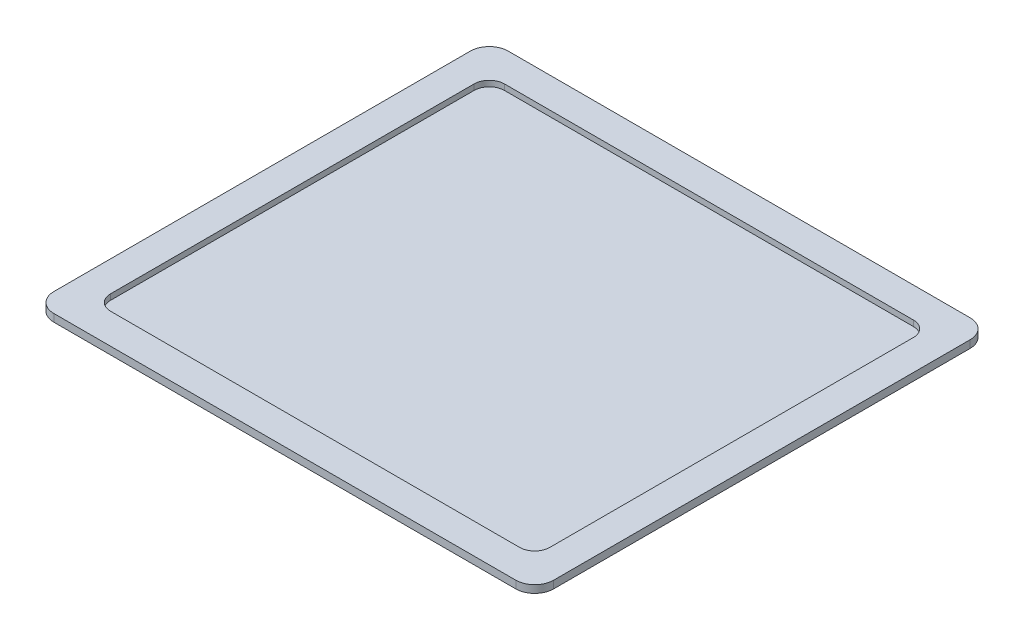
ISO-10303-21;
HEADER;
FILE_DESCRIPTION(('STEP AP214'),'2;1');
FILE_NAME('part.step','',(''),(''),'','','');
FILE_SCHEMA(('AUTOMOTIVE_DESIGN { 1 0 10303 214 1 1 1 1 }'));
ENDSEC;
DATA;
#1=APPLICATION_CONTEXT('core data for automotive mechanical design processes');
#2=APPLICATION_PROTOCOL_DEFINITION('international standard','automotive_design',2000,#1);
#3=PRODUCT_CONTEXT('',#1,'mechanical');
#4=PRODUCT('Part','Part','',(#3));
#5=PRODUCT_RELATED_PRODUCT_CATEGORY('part','',(#4));
#6=PRODUCT_DEFINITION_FORMATION('','',#4);
#7=PRODUCT_DEFINITION_CONTEXT('part definition',#1,'design');
#8=PRODUCT_DEFINITION('design','',#6,#7);
#9=PRODUCT_DEFINITION_SHAPE('','',#8);
#10=(LENGTH_UNIT() NAMED_UNIT(*) SI_UNIT(.MILLI.,.METRE.));
#11=(NAMED_UNIT(*) PLANE_ANGLE_UNIT() SI_UNIT($,.RADIAN.));
#12=(NAMED_UNIT(*) SI_UNIT($,.STERADIAN.) SOLID_ANGLE_UNIT());
#13=UNCERTAINTY_MEASURE_WITH_UNIT(LENGTH_MEASURE(1.E-05),#10,'distance_accuracy_value','');
#14=(GEOMETRIC_REPRESENTATION_CONTEXT(3) GLOBAL_UNCERTAINTY_ASSIGNED_CONTEXT((#13)) GLOBAL_UNIT_ASSIGNED_CONTEXT((#10,
#11,#12)) REPRESENTATION_CONTEXT('',''));
#15=CARTESIAN_POINT('',(0.,0.,0.));
#16=DIRECTION('',(0.,0.,1.));
#17=DIRECTION('',(1.,0.,0.));
#18=AXIS2_PLACEMENT_3D('',#15,#16,#17);
#19=CARTESIAN_POINT('',(305.,0.,275.));
#20=DIRECTION('',(0.,1.,0.));
#21=DIRECTION('',(0.,0.,1.));
#22=AXIS2_PLACEMENT_3D('',#19,#20,#21);
#23=PLANE('',#22);
#24=CARTESIAN_POINT('',(305.,0.,275.));
#25=DIRECTION('',(0.,1.,0.));
#26=DIRECTION('',(0.,0.,1.));
#27=AXIS2_PLACEMENT_3D('',#24,#25,#26);
#28=CIRCLE('',#27,25.);
#29=CARTESIAN_POINT('',(305.,0.,300.));
#30=VERTEX_POINT('',#29);
#31=CARTESIAN_POINT('',(330.,0.,275.));
#32=VERTEX_POINT('',#31);
#33=EDGE_CURVE('E303',#30,#32,#28,.T.);
#34=ORIENTED_EDGE('',*,*,#33,.F.);
#35=DIRECTION('',(1.,0.,0.));
#36=VECTOR('',#35,1.);
#37=CARTESIAN_POINT('',(-305.,0.,300.));
#38=LINE('',#37,#36);
#39=CARTESIAN_POINT('',(-305.,0.,300.));
#40=VERTEX_POINT('',#39);
#41=EDGE_CURVE('E308',#40,#30,#38,.T.);
#42=ORIENTED_EDGE('',*,*,#41,.F.);
#43=CARTESIAN_POINT('',(-305.,0.,275.));
#44=DIRECTION('',(0.,1.,0.));
#45=DIRECTION('',(0.,0.,-1.));
#46=AXIS2_PLACEMENT_3D('',#43,#44,#45);
#47=CIRCLE('',#46,25.);
#48=CARTESIAN_POINT('',(-330.,0.,275.));
#49=VERTEX_POINT('',#48);
#50=EDGE_CURVE('E335',#49,#40,#47,.T.);
#51=ORIENTED_EDGE('',*,*,#50,.F.);
#52=DIRECTION('',(0.,0.,1.));
#53=VECTOR('',#52,1.);
#54=CARTESIAN_POINT('',(-330.,0.,275.));
#55=LINE('',#54,#53);
#56=CARTESIAN_POINT('',(-330.,0.,-275.));
#57=VERTEX_POINT('',#56);
#58=EDGE_CURVE('E333',#57,#49,#55,.T.);
#59=ORIENTED_EDGE('',*,*,#58,.F.);
#60=CARTESIAN_POINT('',(-305.,0.,-275.));
#61=DIRECTION('',(0.,1.,0.));
#62=DIRECTION('',(0.,0.,-1.));
#63=AXIS2_PLACEMENT_3D('',#60,#61,#62);
#64=CIRCLE('',#63,25.);
#65=CARTESIAN_POINT('',(-305.,0.,-300.));
#66=VERTEX_POINT('',#65);
#67=EDGE_CURVE('E331',#66,#57,#64,.T.);
#68=ORIENTED_EDGE('',*,*,#67,.F.);
#69=DIRECTION('',(-1.,0.,0.));
#70=VECTOR('',#69,1.);
#71=CARTESIAN_POINT('',(-305.,0.,-300.));
#72=LINE('',#71,#70);
#73=CARTESIAN_POINT('',(305.,0.,-300.));
#74=VERTEX_POINT('',#73);
#75=EDGE_CURVE('E329',#74,#66,#72,.T.);
#76=ORIENTED_EDGE('',*,*,#75,.F.);
#77=CARTESIAN_POINT('',(305.,0.,-275.));
#78=DIRECTION('',(0.,1.,0.));
#79=DIRECTION('',(0.,0.,-1.));
#80=AXIS2_PLACEMENT_3D('',#77,#78,#79);
#81=CIRCLE('',#80,25.);
#82=CARTESIAN_POINT('',(330.,0.,-275.));
#83=VERTEX_POINT('',#82);
#84=EDGE_CURVE('E327',#83,#74,#81,.T.);
#85=ORIENTED_EDGE('',*,*,#84,.F.);
#86=DIRECTION('',(0.,0.,-1.));
#87=VECTOR('',#86,1.);
#88=CARTESIAN_POINT('',(330.,0.,275.));
#89=LINE('',#88,#87);
#90=EDGE_CURVE('E325',#32,#83,#89,.T.);
#91=ORIENTED_EDGE('',*,*,#90,.F.);
#92=EDGE_LOOP('',(#34,#42,#51,#59,#68,#76,#85,#91));
#93=FACE_BOUND('',#92,.T.);
#94=CARTESIAN_POINT('',(270.,0.,240.));
#95=DIRECTION('',(0.,1.,0.));
#96=DIRECTION('',(0.,0.,1.));
#97=AXIS2_PLACEMENT_3D('',#94,#95,#96);
#98=CIRCLE('',#97,30.);
#99=CARTESIAN_POINT('',(300.,0.,240.));
#100=VERTEX_POINT('',#99);
#101=CARTESIAN_POINT('',(270.,0.,270.));
#102=VERTEX_POINT('',#101);
#103=EDGE_CURVE('E11',#100,#102,#98,.F.);
#104=ORIENTED_EDGE('',*,*,#103,.F.);
#105=DIRECTION('',(0.,0.,1.));
#106=VECTOR('',#105,1.);
#107=CARTESIAN_POINT('',(300.,0.,275.));
#108=LINE('',#107,#106);
#109=CARTESIAN_POINT('',(300.,0.,-240.));
#110=VERTEX_POINT('',#109);
#111=EDGE_CURVE('E42',#110,#100,#108,.T.);
#112=ORIENTED_EDGE('',*,*,#111,.F.);
#113=CARTESIAN_POINT('',(270.,0.,-240.));
#114=DIRECTION('',(0.,1.,0.));
#115=DIRECTION('',(0.,0.,1.));
#116=AXIS2_PLACEMENT_3D('',#113,#114,#115);
#117=CIRCLE('',#116,30.);
#118=CARTESIAN_POINT('',(270.,0.,-270.));
#119=VERTEX_POINT('',#118);
#120=EDGE_CURVE('E379',#119,#110,#117,.F.);
#121=ORIENTED_EDGE('',*,*,#120,.F.);
#122=DIRECTION('',(1.,0.,0.));
#123=VECTOR('',#122,1.);
#124=CARTESIAN_POINT('',(305.,0.,-270.));
#125=LINE('',#124,#123);
#126=CARTESIAN_POINT('',(-270.,0.,-270.));
#127=VERTEX_POINT('',#126);
#128=EDGE_CURVE('E376',#127,#119,#125,.T.);
#129=ORIENTED_EDGE('',*,*,#128,.F.);
#130=CARTESIAN_POINT('',(-270.,0.,-240.));
#131=DIRECTION('',(0.,1.,0.));
#132=DIRECTION('',(0.,0.,1.));
#133=AXIS2_PLACEMENT_3D('',#130,#131,#132);
#134=CIRCLE('',#133,30.);
#135=CARTESIAN_POINT('',(-300.,0.,-240.));
#136=VERTEX_POINT('',#135);
#137=EDGE_CURVE('E373',#136,#127,#134,.F.);
#138=ORIENTED_EDGE('',*,*,#137,.F.);
#139=DIRECTION('',(0.,0.,-1.));
#140=VECTOR('',#139,1.);
#141=CARTESIAN_POINT('',(-300.,0.,275.));
#142=LINE('',#141,#140);
#143=CARTESIAN_POINT('',(-300.,0.,240.));
#144=VERTEX_POINT('',#143);
#145=EDGE_CURVE('E370',#144,#136,#142,.T.);
#146=ORIENTED_EDGE('',*,*,#145,.F.);
#147=CARTESIAN_POINT('',(-270.,0.,240.));
#148=DIRECTION('',(0.,1.,0.));
#149=DIRECTION('',(0.,0.,1.));
#150=AXIS2_PLACEMENT_3D('',#147,#148,#149);
#151=CIRCLE('',#150,30.);
#152=CARTESIAN_POINT('',(-270.,0.,270.));
#153=VERTEX_POINT('',#152);
#154=EDGE_CURVE('E367',#153,#144,#151,.F.);
#155=ORIENTED_EDGE('',*,*,#154,.F.);
#156=DIRECTION('',(-1.,0.,0.));
#157=VECTOR('',#156,1.);
#158=CARTESIAN_POINT('',(305.,0.,270.));
#159=LINE('',#158,#157);
#160=EDGE_CURVE('E364',#102,#153,#159,.T.);
#161=ORIENTED_EDGE('',*,*,#160,.F.);
#162=EDGE_LOOP('',(#104,#112,#121,#129,#138,#146,#155,#161));
#163=FACE_BOUND('',#162,.T.);
#164=ADVANCED_FACE('F34',(#93,#163),#23,.F.);
#165=CARTESIAN_POINT('',(305.,10.,275.));
#166=DIRECTION('',(0.,1.,0.));
#167=DIRECTION('',(0.,0.,1.));
#168=AXIS2_PLACEMENT_3D('',#165,#166,#167);
#169=PLANE('',#168);
#170=CARTESIAN_POINT('',(305.,10.,275.));
#171=DIRECTION('',(0.,1.,0.));
#172=DIRECTION('',(0.,0.,1.));
#173=AXIS2_PLACEMENT_3D('',#170,#171,#172);
#174=CIRCLE('',#173,25.);
#175=CARTESIAN_POINT('',(305.,10.,300.));
#176=VERTEX_POINT('',#175);
#177=CARTESIAN_POINT('',(330.,10.,275.));
#178=VERTEX_POINT('',#177);
#179=EDGE_CURVE('E304',#176,#178,#174,.T.);
#180=ORIENTED_EDGE('',*,*,#179,.T.);
#181=DIRECTION('',(0.,0.,-1.));
#182=VECTOR('',#181,1.);
#183=CARTESIAN_POINT('',(330.,10.,275.));
#184=LINE('',#183,#182);
#185=CARTESIAN_POINT('',(330.,10.,-275.));
#186=VERTEX_POINT('',#185);
#187=EDGE_CURVE('E307',#178,#186,#184,.T.);
#188=ORIENTED_EDGE('',*,*,#187,.T.);
#189=CARTESIAN_POINT('',(305.,10.,-275.));
#190=DIRECTION('',(0.,1.,0.));
#191=DIRECTION('',(0.,0.,-1.));
#192=AXIS2_PLACEMENT_3D('',#189,#190,#191);
#193=CIRCLE('',#192,25.);
#194=CARTESIAN_POINT('',(305.,10.,-300.));
#195=VERTEX_POINT('',#194);
#196=EDGE_CURVE('E310',#186,#195,#193,.T.);
#197=ORIENTED_EDGE('',*,*,#196,.T.);
#198=DIRECTION('',(-1.,0.,0.));
#199=VECTOR('',#198,1.);
#200=CARTESIAN_POINT('',(-305.,10.,-300.));
#201=LINE('',#200,#199);
#202=CARTESIAN_POINT('',(-305.,10.,-300.));
#203=VERTEX_POINT('',#202);
#204=EDGE_CURVE('E312',#195,#203,#201,.T.);
#205=ORIENTED_EDGE('',*,*,#204,.T.);
#206=CARTESIAN_POINT('',(-305.,10.,-275.));
#207=DIRECTION('',(0.,1.,0.));
#208=DIRECTION('',(0.,0.,-1.));
#209=AXIS2_PLACEMENT_3D('',#206,#207,#208);
#210=CIRCLE('',#209,25.);
#211=CARTESIAN_POINT('',(-330.,10.,-275.));
#212=VERTEX_POINT('',#211);
#213=EDGE_CURVE('E314',#203,#212,#210,.T.);
#214=ORIENTED_EDGE('',*,*,#213,.T.);
#215=DIRECTION('',(0.,0.,1.));
#216=VECTOR('',#215,1.);
#217=CARTESIAN_POINT('',(-330.,10.,275.));
#218=LINE('',#217,#216);
#219=CARTESIAN_POINT('',(-330.,10.,275.));
#220=VERTEX_POINT('',#219);
#221=EDGE_CURVE('E316',#212,#220,#218,.T.);
#222=ORIENTED_EDGE('',*,*,#221,.T.);
#223=CARTESIAN_POINT('',(-305.,10.,275.));
#224=DIRECTION('',(0.,1.,0.));
#225=DIRECTION('',(0.,0.,-1.));
#226=AXIS2_PLACEMENT_3D('',#223,#224,#225);
#227=CIRCLE('',#226,25.);
#228=CARTESIAN_POINT('',(-305.,10.,300.));
#229=VERTEX_POINT('',#228);
#230=EDGE_CURVE('E318',#220,#229,#227,.T.);
#231=ORIENTED_EDGE('',*,*,#230,.T.);
#232=DIRECTION('',(1.,0.,0.));
#233=VECTOR('',#232,1.);
#234=CARTESIAN_POINT('',(-305.,10.,300.));
#235=LINE('',#234,#233);
#236=EDGE_CURVE('E320',#229,#176,#235,.T.);
#237=ORIENTED_EDGE('',*,*,#236,.T.);
#238=EDGE_LOOP('',(#180,#188,#197,#205,#214,#222,#231,#237));
#239=FACE_BOUND('',#238,.T.);
#240=DIRECTION('',(1.,0.,0.));
#241=VECTOR('',#240,1.);
#242=CARTESIAN_POINT('',(270.,10.,260.));
#243=LINE('',#242,#241);
#244=CARTESIAN_POINT('',(-270.,10.,260.));
#245=VERTEX_POINT('',#244);
#246=CARTESIAN_POINT('',(270.,10.,260.));
#247=VERTEX_POINT('',#246);
#248=EDGE_CURVE('E265',#245,#247,#243,.T.);
#249=ORIENTED_EDGE('',*,*,#248,.F.);
#250=CARTESIAN_POINT('',(-270.,10.,240.));
#251=DIRECTION('',(0.,1.,0.));
#252=DIRECTION('',(0.,0.,-1.));
#253=AXIS2_PLACEMENT_3D('',#250,#251,#252);
#254=CIRCLE('',#253,20.);
#255=CARTESIAN_POINT('',(-290.,10.,240.));
#256=VERTEX_POINT('',#255);
#257=EDGE_CURVE('E263',#256,#245,#254,.T.);
#258=ORIENTED_EDGE('',*,*,#257,.F.);
#259=DIRECTION('',(0.,0.,1.));
#260=VECTOR('',#259,1.);
#261=CARTESIAN_POINT('',(-290.,10.,240.));
#262=LINE('',#261,#260);
#263=CARTESIAN_POINT('',(-290.,10.,-240.));
#264=VERTEX_POINT('',#263);
#265=EDGE_CURVE('E278',#264,#256,#262,.T.);
#266=ORIENTED_EDGE('',*,*,#265,.F.);
#267=CARTESIAN_POINT('',(-270.,10.,-240.));
#268=DIRECTION('',(0.,1.,0.));
#269=DIRECTION('',(0.,0.,1.));
#270=AXIS2_PLACEMENT_3D('',#267,#268,#269);
#271=CIRCLE('',#270,20.);
#272=CARTESIAN_POINT('',(-270.,10.,-260.));
#273=VERTEX_POINT('',#272);
#274=EDGE_CURVE('E275',#273,#264,#271,.T.);
#275=ORIENTED_EDGE('',*,*,#274,.F.);
#276=DIRECTION('',(-1.,0.,0.));
#277=VECTOR('',#276,1.);
#278=CARTESIAN_POINT('',(270.,10.,-260.));
#279=LINE('',#278,#277);
#280=CARTESIAN_POINT('',(270.,10.,-260.));
#281=VERTEX_POINT('',#280);
#282=EDGE_CURVE('E273',#281,#273,#279,.T.);
#283=ORIENTED_EDGE('',*,*,#282,.F.);
#284=CARTESIAN_POINT('',(270.,10.,-240.));
#285=DIRECTION('',(0.,1.,0.));
#286=DIRECTION('',(0.,0.,1.));
#287=AXIS2_PLACEMENT_3D('',#284,#285,#286);
#288=CIRCLE('',#287,20.);
#289=CARTESIAN_POINT('',(290.,10.,-240.));
#290=VERTEX_POINT('',#289);
#291=EDGE_CURVE('E271',#290,#281,#288,.T.);
#292=ORIENTED_EDGE('',*,*,#291,.F.);
#293=DIRECTION('',(0.,0.,-1.));
#294=VECTOR('',#293,1.);
#295=CARTESIAN_POINT('',(290.,10.,240.));
#296=LINE('',#295,#294);
#297=CARTESIAN_POINT('',(290.,10.,240.));
#298=VERTEX_POINT('',#297);
#299=EDGE_CURVE('E269',#298,#290,#296,.T.);
#300=ORIENTED_EDGE('',*,*,#299,.F.);
#301=CARTESIAN_POINT('',(270.,10.,240.));
#302=DIRECTION('',(0.,1.,0.));
#303=DIRECTION('',(0.,0.,1.));
#304=AXIS2_PLACEMENT_3D('',#301,#302,#303);
#305=CIRCLE('',#304,20.);
#306=EDGE_CURVE('E267',#247,#298,#305,.T.);
#307=ORIENTED_EDGE('',*,*,#306,.F.);
#308=EDGE_LOOP('',(#249,#258,#266,#275,#283,#292,#300,#307));
#309=FACE_BOUND('',#308,.T.);
#310=ADVANCED_FACE('F409',(#239,#309),#169,.T.);
#311=CARTESIAN_POINT('',(305.,10.,275.));
#312=DIRECTION('',(0.,-1.,0.));
#313=DIRECTION('',(0.,0.,-1.));
#314=AXIS2_PLACEMENT_3D('',#311,#312,#313);
#315=CYLINDRICAL_SURFACE('',#314,25.);
#316=ORIENTED_EDGE('',*,*,#33,.T.);
#317=DIRECTION('',(0.,-1.,0.));
#318=VECTOR('',#317,1.);
#319=CARTESIAN_POINT('',(330.,10.,275.));
#320=LINE('',#319,#318);
#321=EDGE_CURVE('E358',#178,#32,#320,.T.);
#322=ORIENTED_EDGE('',*,*,#321,.F.);
#323=ORIENTED_EDGE('',*,*,#179,.F.);
#324=DIRECTION('',(0.,-1.,0.));
#325=VECTOR('',#324,1.);
#326=CARTESIAN_POINT('',(305.,10.,300.));
#327=LINE('',#326,#325);
#328=EDGE_CURVE('E322',#176,#30,#327,.T.);
#329=ORIENTED_EDGE('',*,*,#328,.T.);
#330=EDGE_LOOP('',(#316,#322,#323,#329));
#331=FACE_BOUND('',#330,.T.);
#332=ADVANCED_FACE('F36',(#331),#315,.T.);
#333=CARTESIAN_POINT('',(330.,10.,275.));
#334=DIRECTION('',(-1.,0.,0.));
#335=DIRECTION('',(0.,0.,1.));
#336=AXIS2_PLACEMENT_3D('',#333,#334,#335);
#337=PLANE('',#336);
#338=ORIENTED_EDGE('',*,*,#90,.T.);
#339=DIRECTION('',(0.,-1.,0.));
#340=VECTOR('',#339,1.);
#341=CARTESIAN_POINT('',(330.,10.,-275.));
#342=LINE('',#341,#340);
#343=EDGE_CURVE('E355',#186,#83,#342,.T.);
#344=ORIENTED_EDGE('',*,*,#343,.F.);
#345=ORIENTED_EDGE('',*,*,#187,.F.);
#346=ORIENTED_EDGE('',*,*,#321,.T.);
#347=EDGE_LOOP('',(#338,#344,#345,#346));
#348=FACE_BOUND('',#347,.T.);
#349=ADVANCED_FACE('F443',(#348),#337,.F.);
#350=CARTESIAN_POINT('',(305.,10.,-275.));
#351=DIRECTION('',(0.,-1.,0.));
#352=DIRECTION('',(0.,0.,-1.));
#353=AXIS2_PLACEMENT_3D('',#350,#351,#352);
#354=CYLINDRICAL_SURFACE('',#353,25.);
#355=ORIENTED_EDGE('',*,*,#84,.T.);
#356=DIRECTION('',(0.,-1.,0.));
#357=VECTOR('',#356,1.);
#358=CARTESIAN_POINT('',(305.,10.,-300.));
#359=LINE('',#358,#357);
#360=EDGE_CURVE('E352',#195,#74,#359,.T.);
#361=ORIENTED_EDGE('',*,*,#360,.F.);
#362=ORIENTED_EDGE('',*,*,#196,.F.);
#363=ORIENTED_EDGE('',*,*,#343,.T.);
#364=EDGE_LOOP('',(#355,#361,#362,#363));
#365=FACE_BOUND('',#364,.T.);
#366=ADVANCED_FACE('F440',(#365),#354,.T.);
#367=CARTESIAN_POINT('',(-305.,10.,-300.));
#368=DIRECTION('',(0.,0.,1.));
#369=DIRECTION('',(1.,0.,0.));
#370=AXIS2_PLACEMENT_3D('',#367,#368,#369);
#371=PLANE('',#370);
#372=ORIENTED_EDGE('',*,*,#75,.T.);
#373=DIRECTION('',(0.,-1.,0.));
#374=VECTOR('',#373,1.);
#375=CARTESIAN_POINT('',(-305.,10.,-300.));
#376=LINE('',#375,#374);
#377=EDGE_CURVE('E349',#203,#66,#376,.T.);
#378=ORIENTED_EDGE('',*,*,#377,.F.);
#379=ORIENTED_EDGE('',*,*,#204,.F.);
#380=ORIENTED_EDGE('',*,*,#360,.T.);
#381=EDGE_LOOP('',(#372,#378,#379,#380));
#382=FACE_BOUND('',#381,.T.);
#383=ADVANCED_FACE('F436',(#382),#371,.F.);
#384=CARTESIAN_POINT('',(-305.,10.,-275.));
#385=DIRECTION('',(0.,-1.,0.));
#386=DIRECTION('',(0.,0.,-1.));
#387=AXIS2_PLACEMENT_3D('',#384,#385,#386);
#388=CYLINDRICAL_SURFACE('',#387,25.);
#389=ORIENTED_EDGE('',*,*,#67,.T.);
#390=DIRECTION('',(0.,-1.,0.));
#391=VECTOR('',#390,1.);
#392=CARTESIAN_POINT('',(-330.,10.,-275.));
#393=LINE('',#392,#391);
#394=EDGE_CURVE('E346',#212,#57,#393,.T.);
#395=ORIENTED_EDGE('',*,*,#394,.F.);
#396=ORIENTED_EDGE('',*,*,#213,.F.);
#397=ORIENTED_EDGE('',*,*,#377,.T.);
#398=EDGE_LOOP('',(#389,#395,#396,#397));
#399=FACE_BOUND('',#398,.T.);
#400=ADVANCED_FACE('F432',(#399),#388,.T.);
#401=CARTESIAN_POINT('',(-330.,10.,275.));
#402=DIRECTION('',(1.,0.,0.));
#403=DIRECTION('',(0.,0.,-1.));
#404=AXIS2_PLACEMENT_3D('',#401,#402,#403);
#405=PLANE('',#404);
#406=ORIENTED_EDGE('',*,*,#58,.T.);
#407=DIRECTION('',(0.,-1.,0.));
#408=VECTOR('',#407,1.);
#409=CARTESIAN_POINT('',(-330.,10.,275.));
#410=LINE('',#409,#408);
#411=EDGE_CURVE('E343',#220,#49,#410,.T.);
#412=ORIENTED_EDGE('',*,*,#411,.F.);
#413=ORIENTED_EDGE('',*,*,#221,.F.);
#414=ORIENTED_EDGE('',*,*,#394,.T.);
#415=EDGE_LOOP('',(#406,#412,#413,#414));
#416=FACE_BOUND('',#415,.T.);
#417=ADVANCED_FACE('F428',(#416),#405,.F.);
#418=CARTESIAN_POINT('',(-305.,10.,275.));
#419=DIRECTION('',(0.,-1.,0.));
#420=DIRECTION('',(0.,0.,-1.));
#421=AXIS2_PLACEMENT_3D('',#418,#419,#420);
#422=CYLINDRICAL_SURFACE('',#421,25.);
#423=ORIENTED_EDGE('',*,*,#50,.T.);
#424=DIRECTION('',(0.,-1.,0.));
#425=VECTOR('',#424,1.);
#426=CARTESIAN_POINT('',(-305.,10.,300.));
#427=LINE('',#426,#425);
#428=EDGE_CURVE('E340',#229,#40,#427,.T.);
#429=ORIENTED_EDGE('',*,*,#428,.F.);
#430=ORIENTED_EDGE('',*,*,#230,.F.);
#431=ORIENTED_EDGE('',*,*,#411,.T.);
#432=EDGE_LOOP('',(#423,#429,#430,#431));
#433=FACE_BOUND('',#432,.T.);
#434=ADVANCED_FACE('F424',(#433),#422,.T.);
#435=CARTESIAN_POINT('',(-305.,10.,300.));
#436=DIRECTION('',(0.,0.,-1.));
#437=DIRECTION('',(-1.,0.,0.));
#438=AXIS2_PLACEMENT_3D('',#435,#436,#437);
#439=PLANE('',#438);
#440=ORIENTED_EDGE('',*,*,#41,.T.);
#441=ORIENTED_EDGE('',*,*,#328,.F.);
#442=ORIENTED_EDGE('',*,*,#236,.F.);
#443=ORIENTED_EDGE('',*,*,#428,.T.);
#444=EDGE_LOOP('',(#440,#441,#442,#443));
#445=FACE_BOUND('',#444,.T.);
#446=ADVANCED_FACE('F420',(#445),#439,.F.);
#447=CARTESIAN_POINT('',(-270.,10.,240.));
#448=DIRECTION('',(0.,-1.,0.));
#449=DIRECTION('',(0.,0.,-1.));
#450=AXIS2_PLACEMENT_3D('',#447,#448,#449);
#451=CYLINDRICAL_SURFACE('',#450,20.);
#452=CARTESIAN_POINT('',(-270.,2.5,240.));
#453=DIRECTION('',(0.,1.,0.));
#454=DIRECTION('',(0.,0.,1.));
#455=AXIS2_PLACEMENT_3D('',#452,#453,#454);
#456=CIRCLE('',#455,20.);
#457=CARTESIAN_POINT('',(-290.,2.5,240.));
#458=VERTEX_POINT('',#457);
#459=CARTESIAN_POINT('',(-270.,2.5,260.));
#460=VERTEX_POINT('',#459);
#461=EDGE_CURVE('E260',#458,#460,#456,.T.);
#462=ORIENTED_EDGE('',*,*,#461,.F.);
#463=DIRECTION('',(0.,-1.,0.));
#464=VECTOR('',#463,1.);
#465=CARTESIAN_POINT('',(-290.,10.,240.));
#466=LINE('',#465,#464);
#467=EDGE_CURVE('E280',#256,#458,#466,.T.);
#468=ORIENTED_EDGE('',*,*,#467,.F.);
#469=ORIENTED_EDGE('',*,*,#257,.T.);
#470=DIRECTION('',(0.,-1.,0.));
#471=VECTOR('',#470,1.);
#472=CARTESIAN_POINT('',(-270.,10.,260.));
#473=LINE('',#472,#471);
#474=EDGE_CURVE('E300',#245,#460,#473,.T.);
#475=ORIENTED_EDGE('',*,*,#474,.T.);
#476=EDGE_LOOP('',(#462,#468,#469,#475));
#477=FACE_BOUND('',#476,.T.);
#478=ADVANCED_FACE('F423',(#477),#451,.F.);
#479=CARTESIAN_POINT('',(270.,10.,260.));
#480=DIRECTION('',(0.,0.,-1.));
#481=DIRECTION('',(-1.,0.,0.));
#482=AXIS2_PLACEMENT_3D('',#479,#480,#481);
#483=PLANE('',#482);
#484=DIRECTION('',(1.,0.,0.));
#485=VECTOR('',#484,1.);
#486=CARTESIAN_POINT('',(270.,2.5,260.));
#487=LINE('',#486,#485);
#488=CARTESIAN_POINT('',(270.,2.5,260.));
#489=VERTEX_POINT('',#488);
#490=EDGE_CURVE('E257',#460,#489,#487,.T.);
#491=ORIENTED_EDGE('',*,*,#490,.F.);
#492=ORIENTED_EDGE('',*,*,#474,.F.);
#493=ORIENTED_EDGE('',*,*,#248,.T.);
#494=DIRECTION('',(0.,-1.,0.));
#495=VECTOR('',#494,1.);
#496=CARTESIAN_POINT('',(270.,10.,260.));
#497=LINE('',#496,#495);
#498=EDGE_CURVE('E297',#247,#489,#497,.T.);
#499=ORIENTED_EDGE('',*,*,#498,.T.);
#500=EDGE_LOOP('',(#491,#492,#493,#499));
#501=FACE_BOUND('',#500,.T.);
#502=ADVANCED_FACE('F481',(#501),#483,.T.);
#503=CARTESIAN_POINT('',(270.,10.,240.));
#504=DIRECTION('',(0.,-1.,0.));
#505=DIRECTION('',(0.,0.,-1.));
#506=AXIS2_PLACEMENT_3D('',#503,#504,#505);
#507=CYLINDRICAL_SURFACE('',#506,20.);
#508=CARTESIAN_POINT('',(270.,2.5,240.));
#509=DIRECTION('',(0.,1.,0.));
#510=DIRECTION('',(0.,0.,1.));
#511=AXIS2_PLACEMENT_3D('',#508,#509,#510);
#512=CIRCLE('',#511,20.);
#513=CARTESIAN_POINT('',(290.,2.5,240.));
#514=VERTEX_POINT('',#513);
#515=EDGE_CURVE('E254',#489,#514,#512,.T.);
#516=ORIENTED_EDGE('',*,*,#515,.F.);
#517=ORIENTED_EDGE('',*,*,#498,.F.);
#518=ORIENTED_EDGE('',*,*,#306,.T.);
#519=DIRECTION('',(0.,-1.,0.));
#520=VECTOR('',#519,1.);
#521=CARTESIAN_POINT('',(290.,10.,240.));
#522=LINE('',#521,#520);
#523=EDGE_CURVE('E294',#298,#514,#522,.T.);
#524=ORIENTED_EDGE('',*,*,#523,.T.);
#525=EDGE_LOOP('',(#516,#517,#518,#524));
#526=FACE_BOUND('',#525,.T.);
#527=ADVANCED_FACE('F483',(#526),#507,.F.);
#528=CARTESIAN_POINT('',(290.,10.,240.));
#529=DIRECTION('',(-1.,0.,0.));
#530=DIRECTION('',(0.,0.,1.));
#531=AXIS2_PLACEMENT_3D('',#528,#529,#530);
#532=PLANE('',#531);
#533=DIRECTION('',(0.,0.,-1.));
#534=VECTOR('',#533,1.);
#535=CARTESIAN_POINT('',(290.,2.5,240.));
#536=LINE('',#535,#534);
#537=CARTESIAN_POINT('',(290.,2.5,-240.));
#538=VERTEX_POINT('',#537);
#539=EDGE_CURVE('E251',#514,#538,#536,.T.);
#540=ORIENTED_EDGE('',*,*,#539,.F.);
#541=ORIENTED_EDGE('',*,*,#523,.F.);
#542=ORIENTED_EDGE('',*,*,#299,.T.);
#543=DIRECTION('',(0.,-1.,0.));
#544=VECTOR('',#543,1.);
#545=CARTESIAN_POINT('',(290.,10.,-240.));
#546=LINE('',#545,#544);
#547=EDGE_CURVE('E291',#290,#538,#546,.T.);
#548=ORIENTED_EDGE('',*,*,#547,.T.);
#549=EDGE_LOOP('',(#540,#541,#542,#548));
#550=FACE_BOUND('',#549,.T.);
#551=ADVANCED_FACE('F505',(#550),#532,.T.);
#552=CARTESIAN_POINT('',(270.,10.,-240.));
#553=DIRECTION('',(0.,-1.,0.));
#554=DIRECTION('',(0.,0.,-1.));
#555=AXIS2_PLACEMENT_3D('',#552,#553,#554);
#556=CYLINDRICAL_SURFACE('',#555,20.);
#557=CARTESIAN_POINT('',(270.,2.5,-240.));
#558=DIRECTION('',(0.,1.,0.));
#559=DIRECTION('',(0.,0.,1.));
#560=AXIS2_PLACEMENT_3D('',#557,#558,#559);
#561=CIRCLE('',#560,20.);
#562=CARTESIAN_POINT('',(270.,2.5,-260.));
#563=VERTEX_POINT('',#562);
#564=EDGE_CURVE('E248',#538,#563,#561,.T.);
#565=ORIENTED_EDGE('',*,*,#564,.F.);
#566=ORIENTED_EDGE('',*,*,#547,.F.);
#567=ORIENTED_EDGE('',*,*,#291,.T.);
#568=DIRECTION('',(0.,-1.,0.));
#569=VECTOR('',#568,1.);
#570=CARTESIAN_POINT('',(270.,10.,-260.));
#571=LINE('',#570,#569);
#572=EDGE_CURVE('E288',#281,#563,#571,.T.);
#573=ORIENTED_EDGE('',*,*,#572,.T.);
#574=EDGE_LOOP('',(#565,#566,#567,#573));
#575=FACE_BOUND('',#574,.T.);
#576=ADVANCED_FACE('F503',(#575),#556,.F.);
#577=CARTESIAN_POINT('',(270.,10.,-260.));
#578=DIRECTION('',(0.,0.,1.));
#579=DIRECTION('',(1.,0.,0.));
#580=AXIS2_PLACEMENT_3D('',#577,#578,#579);
#581=PLANE('',#580);
#582=DIRECTION('',(-1.,0.,0.));
#583=VECTOR('',#582,1.);
#584=CARTESIAN_POINT('',(270.,2.5,-260.));
#585=LINE('',#584,#583);
#586=CARTESIAN_POINT('',(-270.,2.5,-260.));
#587=VERTEX_POINT('',#586);
#588=EDGE_CURVE('E245',#563,#587,#585,.T.);
#589=ORIENTED_EDGE('',*,*,#588,.F.);
#590=ORIENTED_EDGE('',*,*,#572,.F.);
#591=ORIENTED_EDGE('',*,*,#282,.T.);
#592=DIRECTION('',(0.,-1.,0.));
#593=VECTOR('',#592,1.);
#594=CARTESIAN_POINT('',(-270.,10.,-260.));
#595=LINE('',#594,#593);
#596=EDGE_CURVE('E285',#273,#587,#595,.T.);
#597=ORIENTED_EDGE('',*,*,#596,.T.);
#598=EDGE_LOOP('',(#589,#590,#591,#597));
#599=FACE_BOUND('',#598,.T.);
#600=ADVANCED_FACE('F499',(#599),#581,.T.);
#601=CARTESIAN_POINT('',(-270.,10.,-240.));
#602=DIRECTION('',(0.,-1.,0.));
#603=DIRECTION('',(0.,0.,-1.));
#604=AXIS2_PLACEMENT_3D('',#601,#602,#603);
#605=CYLINDRICAL_SURFACE('',#604,20.);
#606=CARTESIAN_POINT('',(-270.,2.5,-240.));
#607=DIRECTION('',(0.,1.,0.));
#608=DIRECTION('',(0.,0.,1.));
#609=AXIS2_PLACEMENT_3D('',#606,#607,#608);
#610=CIRCLE('',#609,20.);
#611=CARTESIAN_POINT('',(-290.,2.5,-240.));
#612=VERTEX_POINT('',#611);
#613=EDGE_CURVE('E198',#587,#612,#610,.T.);
#614=ORIENTED_EDGE('',*,*,#613,.F.);
#615=ORIENTED_EDGE('',*,*,#596,.F.);
#616=ORIENTED_EDGE('',*,*,#274,.T.);
#617=DIRECTION('',(0.,-1.,0.));
#618=VECTOR('',#617,1.);
#619=CARTESIAN_POINT('',(-290.,10.,-240.));
#620=LINE('',#619,#618);
#621=EDGE_CURVE('E282',#264,#612,#620,.T.);
#622=ORIENTED_EDGE('',*,*,#621,.T.);
#623=EDGE_LOOP('',(#614,#615,#616,#622));
#624=FACE_BOUND('',#623,.T.);
#625=ADVANCED_FACE('F497',(#624),#605,.F.);
#626=CARTESIAN_POINT('',(-290.,10.,240.));
#627=DIRECTION('',(1.,0.,0.));
#628=DIRECTION('',(0.,0.,-1.));
#629=AXIS2_PLACEMENT_3D('',#626,#627,#628);
#630=PLANE('',#629);
#631=DIRECTION('',(0.,0.,1.));
#632=VECTOR('',#631,1.);
#633=CARTESIAN_POINT('',(-290.,2.5,240.));
#634=LINE('',#633,#632);
#635=EDGE_CURVE('E361',#612,#458,#634,.T.);
#636=ORIENTED_EDGE('',*,*,#635,.F.);
#637=ORIENTED_EDGE('',*,*,#621,.F.);
#638=ORIENTED_EDGE('',*,*,#265,.T.);
#639=ORIENTED_EDGE('',*,*,#467,.T.);
#640=EDGE_LOOP('',(#636,#637,#638,#639));
#641=FACE_BOUND('',#640,.T.);
#642=ADVANCED_FACE('F491',(#641),#630,.T.);
#643=CARTESIAN_POINT('',(270.,2.5,240.));
#644=DIRECTION('',(0.,1.,0.));
#645=DIRECTION('',(0.,0.,1.));
#646=AXIS2_PLACEMENT_3D('',#643,#644,#645);
#647=PLANE('',#646);
#648=ORIENTED_EDGE('',*,*,#635,.T.);
#649=ORIENTED_EDGE('',*,*,#461,.T.);
#650=ORIENTED_EDGE('',*,*,#490,.T.);
#651=ORIENTED_EDGE('',*,*,#515,.T.);
#652=ORIENTED_EDGE('',*,*,#539,.T.);
#653=ORIENTED_EDGE('',*,*,#564,.T.);
#654=ORIENTED_EDGE('',*,*,#588,.T.);
#655=ORIENTED_EDGE('',*,*,#613,.T.);
#656=EDGE_LOOP('',(#648,#649,#650,#651,#652,#653,#654,#655));
#657=FACE_BOUND('',#656,.T.);
#658=ADVANCED_FACE('F486',(#657),#647,.T.);
#659=CARTESIAN_POINT('',(270.,2.5,240.));
#660=DIRECTION('',(0.,-1.,0.));
#661=DIRECTION('',(0.,0.,-1.));
#662=AXIS2_PLACEMENT_3D('',#659,#660,#661);
#663=CYLINDRICAL_SURFACE('',#662,30.);
#664=DIRECTION('',(0.,-1.,0.));
#665=VECTOR('',#664,1.);
#666=CARTESIAN_POINT('',(300.,2.5,240.));
#667=LINE('',#666,#665);
#668=CARTESIAN_POINT('',(300.,-2.5,240.));
#669=VERTEX_POINT('',#668);
#670=EDGE_CURVE('E190',#100,#669,#667,.T.);
#671=ORIENTED_EDGE('',*,*,#670,.F.);
#672=ORIENTED_EDGE('',*,*,#103,.T.);
#673=DIRECTION('',(0.,-1.,0.));
#674=VECTOR('',#673,1.);
#675=CARTESIAN_POINT('',(270.,2.5,270.));
#676=LINE('',#675,#674);
#677=CARTESIAN_POINT('',(270.,-2.5,270.));
#678=VERTEX_POINT('',#677);
#679=EDGE_CURVE('E212',#102,#678,#676,.T.);
#680=ORIENTED_EDGE('',*,*,#679,.T.);
#681=CARTESIAN_POINT('',(270.,-2.5,240.));
#682=DIRECTION('',(0.,1.,0.));
#683=DIRECTION('',(0.,0.,1.));
#684=AXIS2_PLACEMENT_3D('',#681,#682,#683);
#685=CIRCLE('',#684,30.);
#686=EDGE_CURVE('E205',#678,#669,#685,.T.);
#687=ORIENTED_EDGE('',*,*,#686,.T.);
#688=EDGE_LOOP('',(#671,#672,#680,#687));
#689=FACE_BOUND('',#688,.T.);
#690=ADVANCED_FACE('F210',(#689),#663,.T.);
#691=CARTESIAN_POINT('',(300.,2.5,240.));
#692=DIRECTION('',(-1.,0.,0.));
#693=DIRECTION('',(0.,0.,1.));
#694=AXIS2_PLACEMENT_3D('',#691,#692,#693);
#695=PLANE('',#694);
#696=DIRECTION('',(0.,-1.,0.));
#697=VECTOR('',#696,1.);
#698=CARTESIAN_POINT('',(300.,2.5,-240.));
#699=LINE('',#698,#697);
#700=CARTESIAN_POINT('',(300.,-2.5,-240.));
#701=VERTEX_POINT('',#700);
#702=EDGE_CURVE('E199',#110,#701,#699,.T.);
#703=ORIENTED_EDGE('',*,*,#702,.F.);
#704=ORIENTED_EDGE('',*,*,#111,.T.);
#705=ORIENTED_EDGE('',*,*,#670,.T.);
#706=DIRECTION('',(0.,0.,-1.));
#707=VECTOR('',#706,1.);
#708=CARTESIAN_POINT('',(300.,-2.5,240.));
#709=LINE('',#708,#707);
#710=EDGE_CURVE('E194',#669,#701,#709,.T.);
#711=ORIENTED_EDGE('',*,*,#710,.T.);
#712=EDGE_LOOP('',(#703,#704,#705,#711));
#713=FACE_BOUND('',#712,.T.);
#714=ADVANCED_FACE('F193',(#713),#695,.F.);
#715=CARTESIAN_POINT('',(270.,2.5,-240.));
#716=DIRECTION('',(0.,-1.,0.));
#717=DIRECTION('',(0.,0.,-1.));
#718=AXIS2_PLACEMENT_3D('',#715,#716,#717);
#719=CYLINDRICAL_SURFACE('',#718,30.);
#720=DIRECTION('',(0.,-1.,0.));
#721=VECTOR('',#720,1.);
#722=CARTESIAN_POINT('',(270.,2.5,-270.));
#723=LINE('',#722,#721);
#724=CARTESIAN_POINT('',(270.,-2.5,-270.));
#725=VERTEX_POINT('',#724);
#726=EDGE_CURVE('E240',#119,#725,#723,.T.);
#727=ORIENTED_EDGE('',*,*,#726,.F.);
#728=ORIENTED_EDGE('',*,*,#120,.T.);
#729=ORIENTED_EDGE('',*,*,#702,.T.);
#730=CARTESIAN_POINT('',(270.,-2.5,-240.));
#731=DIRECTION('',(0.,1.,0.));
#732=DIRECTION('',(0.,0.,1.));
#733=AXIS2_PLACEMENT_3D('',#730,#731,#732);
#734=CIRCLE('',#733,30.);
#735=EDGE_CURVE('E208',#701,#725,#734,.T.);
#736=ORIENTED_EDGE('',*,*,#735,.T.);
#737=EDGE_LOOP('',(#727,#728,#729,#736));
#738=FACE_BOUND('',#737,.T.);
#739=ADVANCED_FACE('F382',(#738),#719,.T.);
#740=CARTESIAN_POINT('',(270.,2.5,-270.));
#741=DIRECTION('',(0.,0.,1.));
#742=DIRECTION('',(1.,0.,0.));
#743=AXIS2_PLACEMENT_3D('',#740,#741,#742);
#744=PLANE('',#743);
#745=DIRECTION('',(0.,-1.,0.));
#746=VECTOR('',#745,1.);
#747=CARTESIAN_POINT('',(-270.,2.5,-270.));
#748=LINE('',#747,#746);
#749=CARTESIAN_POINT('',(-270.,-2.5,-270.));
#750=VERTEX_POINT('',#749);
#751=EDGE_CURVE('E238',#127,#750,#748,.T.);
#752=ORIENTED_EDGE('',*,*,#751,.F.);
#753=ORIENTED_EDGE('',*,*,#128,.T.);
#754=ORIENTED_EDGE('',*,*,#726,.T.);
#755=DIRECTION('',(-1.,0.,0.));
#756=VECTOR('',#755,1.);
#757=CARTESIAN_POINT('',(270.,-2.5,-270.));
#758=LINE('',#757,#756);
#759=EDGE_CURVE('E217',#725,#750,#758,.T.);
#760=ORIENTED_EDGE('',*,*,#759,.T.);
#761=EDGE_LOOP('',(#752,#753,#754,#760));
#762=FACE_BOUND('',#761,.T.);
#763=ADVANCED_FACE('F385',(#762),#744,.F.);
#764=CARTESIAN_POINT('',(-270.,2.5,-240.));
#765=DIRECTION('',(0.,-1.,0.));
#766=DIRECTION('',(0.,0.,-1.));
#767=AXIS2_PLACEMENT_3D('',#764,#765,#766);
#768=CYLINDRICAL_SURFACE('',#767,30.);
#769=DIRECTION('',(0.,-1.,0.));
#770=VECTOR('',#769,1.);
#771=CARTESIAN_POINT('',(-300.,2.5,-240.));
#772=LINE('',#771,#770);
#773=CARTESIAN_POINT('',(-300.,-2.5,-240.));
#774=VERTEX_POINT('',#773);
#775=EDGE_CURVE('E236',#136,#774,#772,.T.);
#776=ORIENTED_EDGE('',*,*,#775,.F.);
#777=ORIENTED_EDGE('',*,*,#137,.T.);
#778=ORIENTED_EDGE('',*,*,#751,.T.);
#779=CARTESIAN_POINT('',(-270.,-2.5,-240.));
#780=DIRECTION('',(0.,1.,0.));
#781=DIRECTION('',(0.,0.,1.));
#782=AXIS2_PLACEMENT_3D('',#779,#780,#781);
#783=CIRCLE('',#782,30.);
#784=EDGE_CURVE('E220',#750,#774,#783,.T.);
#785=ORIENTED_EDGE('',*,*,#784,.T.);
#786=EDGE_LOOP('',(#776,#777,#778,#785));
#787=FACE_BOUND('',#786,.T.);
#788=ADVANCED_FACE('F389',(#787),#768,.T.);
#789=CARTESIAN_POINT('',(-300.,2.5,-240.));
#790=DIRECTION('',(1.,0.,0.));
#791=DIRECTION('',(0.,0.,-1.));
#792=AXIS2_PLACEMENT_3D('',#789,#790,#791);
#793=PLANE('',#792);
#794=DIRECTION('',(0.,-1.,0.));
#795=VECTOR('',#794,1.);
#796=CARTESIAN_POINT('',(-300.,2.5,240.));
#797=LINE('',#796,#795);
#798=CARTESIAN_POINT('',(-300.,-2.5,240.));
#799=VERTEX_POINT('',#798);
#800=EDGE_CURVE('E234',#144,#799,#797,.T.);
#801=ORIENTED_EDGE('',*,*,#800,.F.);
#802=ORIENTED_EDGE('',*,*,#145,.T.);
#803=ORIENTED_EDGE('',*,*,#775,.T.);
#804=DIRECTION('',(0.,0.,1.));
#805=VECTOR('',#804,1.);
#806=CARTESIAN_POINT('',(-300.,-2.5,-240.));
#807=LINE('',#806,#805);
#808=EDGE_CURVE('E223',#774,#799,#807,.T.);
#809=ORIENTED_EDGE('',*,*,#808,.T.);
#810=EDGE_LOOP('',(#801,#802,#803,#809));
#811=FACE_BOUND('',#810,.T.);
#812=ADVANCED_FACE('F393',(#811),#793,.F.);
#813=CARTESIAN_POINT('',(-270.,2.5,240.));
#814=DIRECTION('',(0.,-1.,0.));
#815=DIRECTION('',(0.,0.,-1.));
#816=AXIS2_PLACEMENT_3D('',#813,#814,#815);
#817=CYLINDRICAL_SURFACE('',#816,30.);
#818=DIRECTION('',(0.,-1.,0.));
#819=VECTOR('',#818,1.);
#820=CARTESIAN_POINT('',(-270.,2.5,270.));
#821=LINE('',#820,#819);
#822=CARTESIAN_POINT('',(-270.,-2.5,270.));
#823=VERTEX_POINT('',#822);
#824=EDGE_CURVE('E232',#153,#823,#821,.T.);
#825=ORIENTED_EDGE('',*,*,#824,.F.);
#826=ORIENTED_EDGE('',*,*,#154,.T.);
#827=ORIENTED_EDGE('',*,*,#800,.T.);
#828=CARTESIAN_POINT('',(-270.,-2.5,240.));
#829=DIRECTION('',(0.,1.,0.));
#830=DIRECTION('',(0.,0.,1.));
#831=AXIS2_PLACEMENT_3D('',#828,#829,#830);
#832=CIRCLE('',#831,30.);
#833=EDGE_CURVE('E226',#799,#823,#832,.T.);
#834=ORIENTED_EDGE('',*,*,#833,.T.);
#835=EDGE_LOOP('',(#825,#826,#827,#834));
#836=FACE_BOUND('',#835,.T.);
#837=ADVANCED_FACE('F397',(#836),#817,.T.);
#838=CARTESIAN_POINT('',(-270.,2.5,270.));
#839=DIRECTION('',(0.,0.,-1.));
#840=DIRECTION('',(-1.,0.,0.));
#841=AXIS2_PLACEMENT_3D('',#838,#839,#840);
#842=PLANE('',#841);
#843=ORIENTED_EDGE('',*,*,#679,.F.);
#844=ORIENTED_EDGE('',*,*,#160,.T.);
#845=ORIENTED_EDGE('',*,*,#824,.T.);
#846=DIRECTION('',(1.,0.,0.));
#847=VECTOR('',#846,1.);
#848=CARTESIAN_POINT('',(-270.,-2.5,270.));
#849=LINE('',#848,#847);
#850=EDGE_CURVE('E229',#823,#678,#849,.T.);
#851=ORIENTED_EDGE('',*,*,#850,.T.);
#852=EDGE_LOOP('',(#843,#844,#845,#851));
#853=FACE_BOUND('',#852,.T.);
#854=ADVANCED_FACE('F399',(#853),#842,.F.);
#855=CARTESIAN_POINT('',(270.,-2.5,240.));
#856=DIRECTION('',(0.,1.,0.));
#857=DIRECTION('',(0.,0.,1.));
#858=AXIS2_PLACEMENT_3D('',#855,#856,#857);
#859=PLANE('',#858);
#860=ORIENTED_EDGE('',*,*,#686,.F.);
#861=ORIENTED_EDGE('',*,*,#850,.F.);
#862=ORIENTED_EDGE('',*,*,#833,.F.);
#863=ORIENTED_EDGE('',*,*,#808,.F.);
#864=ORIENTED_EDGE('',*,*,#784,.F.);
#865=ORIENTED_EDGE('',*,*,#759,.F.);
#866=ORIENTED_EDGE('',*,*,#735,.F.);
#867=ORIENTED_EDGE('',*,*,#710,.F.);
#868=EDGE_LOOP('',(#860,#861,#862,#863,#864,#865,#866,#867));
#869=FACE_BOUND('',#868,.T.);
#870=ADVANCED_FACE('F203',(#869),#859,.F.);
#871=CLOSED_SHELL('',(#164,#310,#332,#349,#366,#383,#400,#417,#434,#446,#478,#502,#527,#551,
#576,#600,#625,#642,#658,#690,#714,#739,#763,#788,#812,#837,#854,#870));
#872=MANIFOLD_SOLID_BREP('B2',#871);
#873=ADVANCED_BREP_SHAPE_REPRESENTATION('',(#18,#872),#14);
#874=SHAPE_DEFINITION_REPRESENTATION(#9,#873);
ENDSEC;
END-ISO-10303-21;
